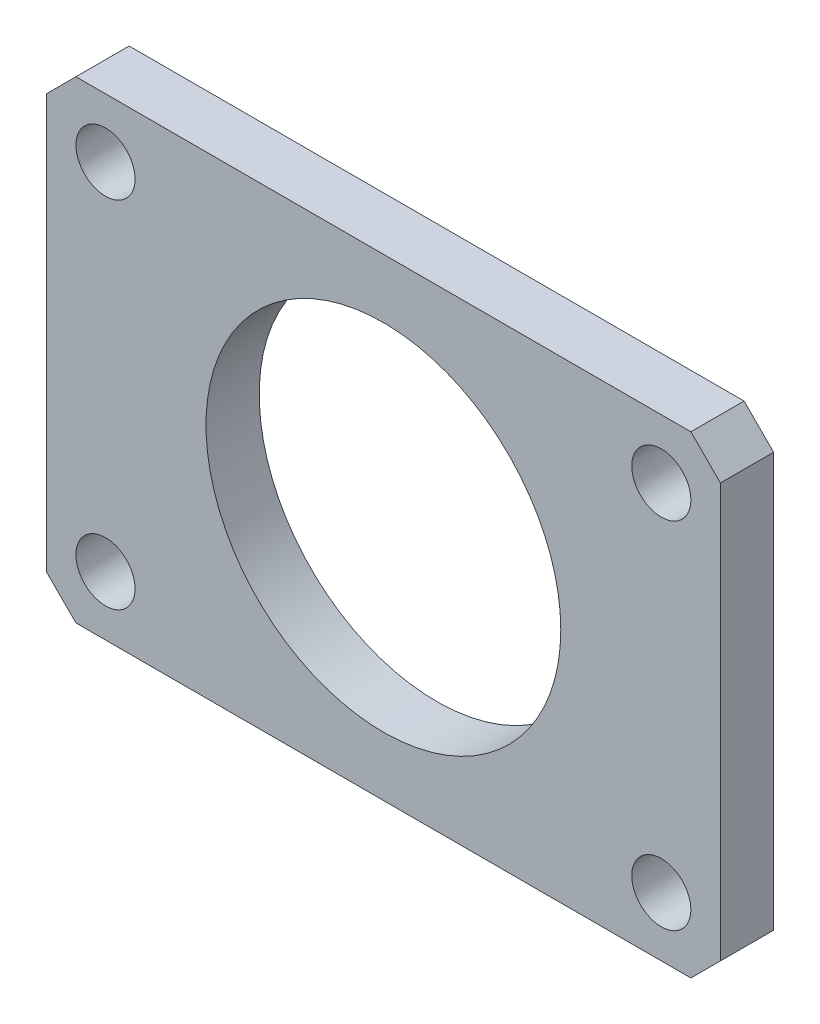
ISO-10303-21;
HEADER;
FILE_DESCRIPTION(('STEP AP214'),'2;1');
FILE_NAME('part.step','',(''),(''),'','','');
FILE_SCHEMA(('AUTOMOTIVE_DESIGN { 1 0 10303 214 1 1 1 1 }'));
ENDSEC;
DATA;
#1=APPLICATION_CONTEXT('core data for automotive mechanical design processes');
#2=APPLICATION_PROTOCOL_DEFINITION('international standard','automotive_design',2000,#1);
#3=PRODUCT_CONTEXT('',#1,'mechanical');
#4=PRODUCT('Part','Part','',(#3));
#5=PRODUCT_RELATED_PRODUCT_CATEGORY('part','',(#4));
#6=PRODUCT_DEFINITION_FORMATION('','',#4);
#7=PRODUCT_DEFINITION_CONTEXT('part definition',#1,'design');
#8=PRODUCT_DEFINITION('design','',#6,#7);
#9=PRODUCT_DEFINITION_SHAPE('','',#8);
#10=(LENGTH_UNIT() NAMED_UNIT(*) SI_UNIT(.MILLI.,.METRE.));
#11=(NAMED_UNIT(*) PLANE_ANGLE_UNIT() SI_UNIT($,.RADIAN.));
#12=(NAMED_UNIT(*) SI_UNIT($,.STERADIAN.) SOLID_ANGLE_UNIT());
#13=UNCERTAINTY_MEASURE_WITH_UNIT(LENGTH_MEASURE(1.E-05),#10,'distance_accuracy_value','');
#14=(GEOMETRIC_REPRESENTATION_CONTEXT(3) GLOBAL_UNCERTAINTY_ASSIGNED_CONTEXT((#13)) GLOBAL_UNIT_ASSIGNED_CONTEXT((#10,
#11,#12)) REPRESENTATION_CONTEXT('',''));
#15=CARTESIAN_POINT('',(0.,0.,0.));
#16=DIRECTION('',(0.,0.,1.));
#17=DIRECTION('',(1.,0.,0.));
#18=AXIS2_PLACEMENT_3D('',#15,#16,#17);
#19=CARTESIAN_POINT('',(0.,0.,4.5));
#20=DIRECTION('',(0.,0.,-1.));
#21=DIRECTION('',(-1.,0.,0.));
#22=AXIS2_PLACEMENT_3D('',#19,#20,#21);
#23=PLANE('',#22);
#24=CARTESIAN_POINT('',(-14.25,-10.,4.5));
#25=DIRECTION('',(0.,0.,1.));
#26=DIRECTION('',(1.,0.,0.));
#27=AXIS2_PLACEMENT_3D('',#24,#25,#26);
#28=CIRCLE('',#27,15.);
#29=CARTESIAN_POINT('',(0.749999999999994,-10.,4.5));
#30=VERTEX_POINT('',#29);
#31=EDGE_CURVE('E331',#30,#30,#28,.T.);
#32=ORIENTED_EDGE('',*,*,#31,.F.);
#33=EDGE_LOOP('',(#32));
#34=FACE_BOUND('',#33,.T.);
#35=DIRECTION('',(0.,1.,0.));
#36=VECTOR('',#35,1.);
#37=CARTESIAN_POINT('',(14.25,-10.,4.5));
#38=LINE('',#37,#36);
#39=CARTESIAN_POINT('',(14.25,-27.5,4.5));
#40=VERTEX_POINT('',#39);
#41=CARTESIAN_POINT('',(14.25,7.49999999999999,4.5));
#42=VERTEX_POINT('',#41);
#43=EDGE_CURVE('E172',#40,#42,#38,.T.);
#44=ORIENTED_EDGE('',*,*,#43,.T.);
#45=DIRECTION('',(0.707106781186547,-0.707106781186549,0.));
#46=VECTOR('',#45,1.);
#47=CARTESIAN_POINT('',(11.75,10.,4.5));
#48=LINE('',#47,#46);
#49=CARTESIAN_POINT('',(11.75,10.,4.5));
#50=VERTEX_POINT('',#49);
#51=EDGE_CURVE('E11',#42,#50,#48,.F.);
#52=ORIENTED_EDGE('',*,*,#51,.T.);
#53=DIRECTION('',(-1.,0.,0.));
#54=VECTOR('',#53,1.);
#55=CARTESIAN_POINT('',(-14.25,10.,4.5));
#56=LINE('',#55,#54);
#57=CARTESIAN_POINT('',(-40.25,10.,4.5));
#58=VERTEX_POINT('',#57);
#59=EDGE_CURVE('E174',#50,#58,#56,.T.);
#60=ORIENTED_EDGE('',*,*,#59,.T.);
#61=DIRECTION('',(-0.707106781186547,-0.707106781186549,0.));
#62=VECTOR('',#61,1.);
#63=CARTESIAN_POINT('',(-40.25,10.,4.5));
#64=LINE('',#63,#62);
#65=CARTESIAN_POINT('',(-42.75,7.49999999999999,4.5));
#66=VERTEX_POINT('',#65);
#67=EDGE_CURVE('E147',#66,#58,#64,.F.);
#68=ORIENTED_EDGE('',*,*,#67,.F.);
#69=DIRECTION('',(0.,1.,0.));
#70=VECTOR('',#69,1.);
#71=CARTESIAN_POINT('',(-42.75,-10.,4.5));
#72=LINE('',#71,#70);
#73=CARTESIAN_POINT('',(-42.75,-27.5,4.5));
#74=VERTEX_POINT('',#73);
#75=EDGE_CURVE('E135',#74,#66,#72,.T.);
#76=ORIENTED_EDGE('',*,*,#75,.F.);
#77=DIRECTION('',(-0.707106781186547,0.707106781186549,0.));
#78=VECTOR('',#77,1.);
#79=CARTESIAN_POINT('',(-40.25,-30.,4.5));
#80=LINE('',#79,#78);
#81=CARTESIAN_POINT('',(-40.25,-30.,4.5));
#82=VERTEX_POINT('',#81);
#83=EDGE_CURVE('E123',#74,#82,#80,.F.);
#84=ORIENTED_EDGE('',*,*,#83,.T.);
#85=DIRECTION('',(-1.,0.,0.));
#86=VECTOR('',#85,1.);
#87=CARTESIAN_POINT('',(-14.25,-30.,4.5));
#88=LINE('',#87,#86);
#89=CARTESIAN_POINT('',(11.75,-30.,4.5));
#90=VERTEX_POINT('',#89);
#91=EDGE_CURVE('E107',#90,#82,#88,.T.);
#92=ORIENTED_EDGE('',*,*,#91,.F.);
#93=DIRECTION('',(0.707106781186547,0.707106781186549,0.));
#94=VECTOR('',#93,1.);
#95=CARTESIAN_POINT('',(11.75,-30.,4.5));
#96=LINE('',#95,#94);
#97=EDGE_CURVE('E162',#40,#90,#96,.F.);
#98=ORIENTED_EDGE('',*,*,#97,.F.);
#99=EDGE_LOOP('',(#44,#52,#60,#68,#76,#84,#92,#98));
#100=FACE_BOUND('',#99,.T.);
#101=CARTESIAN_POINT('',(9.24999999999999,5.,4.5));
#102=DIRECTION('',(0.,0.,1.));
#103=DIRECTION('',(1.,0.,0.));
#104=AXIS2_PLACEMENT_3D('',#101,#102,#103);
#105=CIRCLE('',#104,2.5);
#106=CARTESIAN_POINT('',(11.75,5.,4.5));
#107=VERTEX_POINT('',#106);
#108=EDGE_CURVE('E166',#107,#107,#105,.T.);
#109=ORIENTED_EDGE('',*,*,#108,.F.);
#110=EDGE_LOOP('',(#109));
#111=FACE_BOUND('',#110,.T.);
#112=CARTESIAN_POINT('',(9.24999999999999,-25.,4.5));
#113=DIRECTION('',(0.,0.,-1.));
#114=DIRECTION('',(1.,0.,0.));
#115=AXIS2_PLACEMENT_3D('',#112,#113,#114);
#116=CIRCLE('',#115,2.5);
#117=CARTESIAN_POINT('',(11.75,-25.,4.5));
#118=VERTEX_POINT('',#117);
#119=EDGE_CURVE('E108',#118,#118,#116,.T.);
#120=ORIENTED_EDGE('',*,*,#119,.T.);
#121=EDGE_LOOP('',(#120));
#122=FACE_BOUND('',#121,.T.);
#123=CARTESIAN_POINT('',(-37.75,5.,4.5));
#124=DIRECTION('',(0.,0.,-1.));
#125=DIRECTION('',(-1.,0.,0.));
#126=AXIS2_PLACEMENT_3D('',#123,#124,#125);
#127=CIRCLE('',#126,2.5);
#128=CARTESIAN_POINT('',(-40.25,5.,4.5));
#129=VERTEX_POINT('',#128);
#130=EDGE_CURVE('E129',#129,#129,#127,.T.);
#131=ORIENTED_EDGE('',*,*,#130,.T.);
#132=EDGE_LOOP('',(#131));
#133=FACE_BOUND('',#132,.T.);
#134=CARTESIAN_POINT('',(-37.75,-25.,4.5));
#135=DIRECTION('',(0.,0.,1.));
#136=DIRECTION('',(-1.,0.,0.));
#137=AXIS2_PLACEMENT_3D('',#134,#135,#136);
#138=CIRCLE('',#137,2.5);
#139=CARTESIAN_POINT('',(-40.25,-25.,4.5));
#140=VERTEX_POINT('',#139);
#141=EDGE_CURVE('E117',#140,#140,#138,.T.);
#142=ORIENTED_EDGE('',*,*,#141,.F.);
#143=EDGE_LOOP('',(#142));
#144=FACE_BOUND('',#143,.T.);
#145=ADVANCED_FACE('F34',(#34,#100,#111,#122,#133,#144),#23,.F.);
#146=CARTESIAN_POINT('',(0.,0.,0.));
#147=DIRECTION('',(0.,0.,-1.));
#148=DIRECTION('',(-1.,0.,0.));
#149=AXIS2_PLACEMENT_3D('',#146,#147,#148);
#150=PLANE('',#149);
#151=CARTESIAN_POINT('',(-14.25,-10.,0.));
#152=DIRECTION('',(0.,0.,1.));
#153=DIRECTION('',(1.,0.,0.));
#154=AXIS2_PLACEMENT_3D('',#151,#152,#153);
#155=CIRCLE('',#154,15.);
#156=CARTESIAN_POINT('',(0.749999999999994,-10.,0.));
#157=VERTEX_POINT('',#156);
#158=EDGE_CURVE('E329',#157,#157,#155,.T.);
#159=ORIENTED_EDGE('',*,*,#158,.T.);
#160=EDGE_LOOP('',(#159));
#161=FACE_BOUND('',#160,.T.);
#162=DIRECTION('',(-1.,0.,0.));
#163=VECTOR('',#162,1.);
#164=CARTESIAN_POINT('',(-14.25,10.,0.));
#165=LINE('',#164,#163);
#166=CARTESIAN_POINT('',(11.75,10.,0.));
#167=VERTEX_POINT('',#166);
#168=CARTESIAN_POINT('',(-40.25,10.,0.));
#169=VERTEX_POINT('',#168);
#170=EDGE_CURVE('E175',#167,#169,#165,.T.);
#171=ORIENTED_EDGE('',*,*,#170,.F.);
#172=DIRECTION('',(-0.707106781186547,0.707106781186549,0.));
#173=VECTOR('',#172,1.);
#174=CARTESIAN_POINT('',(10.875,10.875,0.));
#175=LINE('',#174,#173);
#176=CARTESIAN_POINT('',(14.25,7.49999999999999,0.));
#177=VERTEX_POINT('',#176);
#178=EDGE_CURVE('E56',#167,#177,#175,.F.);
#179=ORIENTED_EDGE('',*,*,#178,.T.);
#180=DIRECTION('',(0.,1.,0.));
#181=VECTOR('',#180,1.);
#182=CARTESIAN_POINT('',(14.25,-10.,0.));
#183=LINE('',#182,#181);
#184=CARTESIAN_POINT('',(14.25,-27.5,0.));
#185=VERTEX_POINT('',#184);
#186=EDGE_CURVE('E169',#185,#177,#183,.T.);
#187=ORIENTED_EDGE('',*,*,#186,.F.);
#188=DIRECTION('',(-0.707106781186547,-0.707106781186549,0.));
#189=VECTOR('',#188,1.);
#190=CARTESIAN_POINT('',(10.875,-30.875,0.));
#191=LINE('',#190,#189);
#192=CARTESIAN_POINT('',(11.75,-30.,0.));
#193=VERTEX_POINT('',#192);
#194=EDGE_CURVE('E105',#193,#185,#191,.F.);
#195=ORIENTED_EDGE('',*,*,#194,.F.);
#196=DIRECTION('',(-1.,0.,0.));
#197=VECTOR('',#196,1.);
#198=CARTESIAN_POINT('',(-14.25,-30.,0.));
#199=LINE('',#198,#197);
#200=CARTESIAN_POINT('',(-40.25,-30.,0.));
#201=VERTEX_POINT('',#200);
#202=EDGE_CURVE('E97',#193,#201,#199,.T.);
#203=ORIENTED_EDGE('',*,*,#202,.T.);
#204=DIRECTION('',(0.707106781186547,-0.707106781186549,0.));
#205=VECTOR('',#204,1.);
#206=CARTESIAN_POINT('',(-39.375,-30.875,0.));
#207=LINE('',#206,#205);
#208=CARTESIAN_POINT('',(-42.75,-27.5,0.));
#209=VERTEX_POINT('',#208);
#210=EDGE_CURVE('E103',#201,#209,#207,.F.);
#211=ORIENTED_EDGE('',*,*,#210,.T.);
#212=DIRECTION('',(0.,1.,0.));
#213=VECTOR('',#212,1.);
#214=CARTESIAN_POINT('',(-42.75,-10.,0.));
#215=LINE('',#214,#213);
#216=CARTESIAN_POINT('',(-42.75,7.49999999999999,0.));
#217=VERTEX_POINT('',#216);
#218=EDGE_CURVE('E132',#209,#217,#215,.T.);
#219=ORIENTED_EDGE('',*,*,#218,.T.);
#220=DIRECTION('',(0.707106781186547,0.707106781186549,0.));
#221=VECTOR('',#220,1.);
#222=CARTESIAN_POINT('',(-39.375,10.875,0.));
#223=LINE('',#222,#221);
#224=EDGE_CURVE('E142',#169,#217,#223,.F.);
#225=ORIENTED_EDGE('',*,*,#224,.F.);
#226=EDGE_LOOP('',(#171,#179,#187,#195,#203,#211,#219,#225));
#227=FACE_BOUND('',#226,.T.);
#228=CARTESIAN_POINT('',(9.24999999999999,5.,0.));
#229=DIRECTION('',(0.,0.,1.));
#230=DIRECTION('',(1.,0.,0.));
#231=AXIS2_PLACEMENT_3D('',#228,#229,#230);
#232=CIRCLE('',#231,2.5);
#233=CARTESIAN_POINT('',(11.75,5.,0.));
#234=VERTEX_POINT('',#233);
#235=EDGE_CURVE('E165',#234,#234,#232,.T.);
#236=ORIENTED_EDGE('',*,*,#235,.T.);
#237=EDGE_LOOP('',(#236));
#238=FACE_BOUND('',#237,.T.);
#239=CARTESIAN_POINT('',(9.24999999999999,-25.,0.));
#240=DIRECTION('',(0.,0.,-1.));
#241=DIRECTION('',(1.,0.,0.));
#242=AXIS2_PLACEMENT_3D('',#239,#240,#241);
#243=CIRCLE('',#242,2.5);
#244=CARTESIAN_POINT('',(11.75,-25.,0.));
#245=VERTEX_POINT('',#244);
#246=EDGE_CURVE('E150',#245,#245,#243,.T.);
#247=ORIENTED_EDGE('',*,*,#246,.F.);
#248=EDGE_LOOP('',(#247));
#249=FACE_BOUND('',#248,.T.);
#250=CARTESIAN_POINT('',(-37.75,5.,0.));
#251=DIRECTION('',(0.,0.,-1.));
#252=DIRECTION('',(-1.,0.,0.));
#253=AXIS2_PLACEMENT_3D('',#250,#251,#252);
#254=CIRCLE('',#253,2.5);
#255=CARTESIAN_POINT('',(-40.25,5.,0.));
#256=VERTEX_POINT('',#255);
#257=EDGE_CURVE('E128',#256,#256,#254,.T.);
#258=ORIENTED_EDGE('',*,*,#257,.F.);
#259=EDGE_LOOP('',(#258));
#260=FACE_BOUND('',#259,.T.);
#261=CARTESIAN_POINT('',(-37.75,-25.,0.));
#262=DIRECTION('',(0.,0.,1.));
#263=DIRECTION('',(-1.,0.,0.));
#264=AXIS2_PLACEMENT_3D('',#261,#262,#263);
#265=CIRCLE('',#264,2.5);
#266=CARTESIAN_POINT('',(-40.25,-25.,0.));
#267=VERTEX_POINT('',#266);
#268=EDGE_CURVE('E333',#267,#267,#265,.T.);
#269=ORIENTED_EDGE('',*,*,#268,.T.);
#270=EDGE_LOOP('',(#269));
#271=FACE_BOUND('',#270,.T.);
#272=ADVANCED_FACE('F99',(#161,#227,#238,#249,#260,#271),#150,.T.);
#273=CARTESIAN_POINT('',(14.25,-10.,4.5));
#274=DIRECTION('',(-1.,0.,0.));
#275=DIRECTION('',(0.,0.,1.));
#276=AXIS2_PLACEMENT_3D('',#273,#274,#275);
#277=PLANE('',#276);
#278=ORIENTED_EDGE('',*,*,#186,.T.);
#279=DIRECTION('',(0.,0.,1.));
#280=VECTOR('',#279,1.);
#281=CARTESIAN_POINT('',(14.25,7.49999999999999,4.5));
#282=LINE('',#281,#280);
#283=EDGE_CURVE('E42',#177,#42,#282,.T.);
#284=ORIENTED_EDGE('',*,*,#283,.T.);
#285=ORIENTED_EDGE('',*,*,#43,.F.);
#286=DIRECTION('',(0.,0.,1.));
#287=VECTOR('',#286,1.);
#288=CARTESIAN_POINT('',(14.25,-27.5,4.5));
#289=LINE('',#288,#287);
#290=EDGE_CURVE('E159',#185,#40,#289,.T.);
#291=ORIENTED_EDGE('',*,*,#290,.F.);
#292=EDGE_LOOP('',(#278,#284,#285,#291));
#293=FACE_BOUND('',#292,.T.);
#294=ADVANCED_FACE('F202',(#293),#277,.F.);
#295=CARTESIAN_POINT('',(-14.25,10.,4.5));
#296=DIRECTION('',(0.,-1.,0.));
#297=DIRECTION('',(0.,0.,-1.));
#298=AXIS2_PLACEMENT_3D('',#295,#296,#297);
#299=PLANE('',#298);
#300=ORIENTED_EDGE('',*,*,#59,.F.);
#301=DIRECTION('',(0.,0.,-1.));
#302=VECTOR('',#301,1.);
#303=CARTESIAN_POINT('',(11.75,10.,4.5));
#304=LINE('',#303,#302);
#305=EDGE_CURVE('E177',#50,#167,#304,.T.);
#306=ORIENTED_EDGE('',*,*,#305,.T.);
#307=ORIENTED_EDGE('',*,*,#170,.T.);
#308=DIRECTION('',(0.,0.,-1.));
#309=VECTOR('',#308,1.);
#310=CARTESIAN_POINT('',(-40.25,10.,4.5));
#311=LINE('',#310,#309);
#312=EDGE_CURVE('E138',#58,#169,#311,.T.);
#313=ORIENTED_EDGE('',*,*,#312,.F.);
#314=EDGE_LOOP('',(#300,#306,#307,#313));
#315=FACE_BOUND('',#314,.T.);
#316=ADVANCED_FACE('F185',(#315),#299,.F.);
#317=CARTESIAN_POINT('',(9.24999999999999,5.,4.5));
#318=DIRECTION('',(0.,0.,-1.));
#319=DIRECTION('',(-1.,0.,0.));
#320=AXIS2_PLACEMENT_3D('',#317,#318,#319);
#321=CYLINDRICAL_SURFACE('',#320,2.5);
#322=ORIENTED_EDGE('',*,*,#108,.T.);
#323=EDGE_LOOP('',(#322));
#324=FACE_BOUND('',#323,.T.);
#325=ORIENTED_EDGE('',*,*,#235,.F.);
#326=EDGE_LOOP('',(#325));
#327=FACE_BOUND('',#326,.T.);
#328=ADVANCED_FACE('F204',(#324,#327),#321,.F.);
#329=CARTESIAN_POINT('',(11.75,10.,4.5));
#330=DIRECTION('',(-0.707106781186549,-0.707106781186547,0.));
#331=DIRECTION('',(0.,0.,-1.));
#332=AXIS2_PLACEMENT_3D('',#329,#330,#331);
#333=PLANE('',#332);
#334=ORIENTED_EDGE('',*,*,#51,.F.);
#335=ORIENTED_EDGE('',*,*,#283,.F.);
#336=ORIENTED_EDGE('',*,*,#178,.F.);
#337=ORIENTED_EDGE('',*,*,#305,.F.);
#338=EDGE_LOOP('',(#334,#335,#336,#337));
#339=FACE_BOUND('',#338,.T.);
#340=ADVANCED_FACE('F36',(#339),#333,.F.);
#341=CARTESIAN_POINT('',(-14.25,-30.,4.5));
#342=DIRECTION('',(0.,1.,0.));
#343=DIRECTION('',(0.,0.,-1.));
#344=AXIS2_PLACEMENT_3D('',#341,#342,#343);
#345=PLANE('',#344);
#346=ORIENTED_EDGE('',*,*,#91,.T.);
#347=DIRECTION('',(0.,0.,-1.));
#348=VECTOR('',#347,1.);
#349=CARTESIAN_POINT('',(-40.25,-30.,4.5));
#350=LINE('',#349,#348);
#351=EDGE_CURVE('E111',#82,#201,#350,.T.);
#352=ORIENTED_EDGE('',*,*,#351,.T.);
#353=ORIENTED_EDGE('',*,*,#202,.F.);
#354=DIRECTION('',(0.,0.,-1.));
#355=VECTOR('',#354,1.);
#356=CARTESIAN_POINT('',(11.75,-30.,4.5));
#357=LINE('',#356,#355);
#358=EDGE_CURVE('E155',#90,#193,#357,.T.);
#359=ORIENTED_EDGE('',*,*,#358,.F.);
#360=EDGE_LOOP('',(#346,#352,#353,#359));
#361=FACE_BOUND('',#360,.T.);
#362=ADVANCED_FACE('F112',(#361),#345,.F.);
#363=CARTESIAN_POINT('',(9.24999999999999,-25.,4.5));
#364=DIRECTION('',(0.,0.,-1.));
#365=DIRECTION('',(-1.,0.,0.));
#366=AXIS2_PLACEMENT_3D('',#363,#364,#365);
#367=CYLINDRICAL_SURFACE('',#366,2.5);
#368=ORIENTED_EDGE('',*,*,#119,.F.);
#369=EDGE_LOOP('',(#368));
#370=FACE_BOUND('',#369,.T.);
#371=ORIENTED_EDGE('',*,*,#246,.T.);
#372=EDGE_LOOP('',(#371));
#373=FACE_BOUND('',#372,.T.);
#374=ADVANCED_FACE('F209',(#370,#373),#367,.F.);
#375=CARTESIAN_POINT('',(11.75,-30.,4.5));
#376=DIRECTION('',(-0.707106781186549,0.707106781186547,0.));
#377=DIRECTION('',(0.,0.,-1.));
#378=AXIS2_PLACEMENT_3D('',#375,#376,#377);
#379=PLANE('',#378);
#380=ORIENTED_EDGE('',*,*,#97,.T.);
#381=ORIENTED_EDGE('',*,*,#358,.T.);
#382=ORIENTED_EDGE('',*,*,#194,.T.);
#383=ORIENTED_EDGE('',*,*,#290,.T.);
#384=EDGE_LOOP('',(#380,#381,#382,#383));
#385=FACE_BOUND('',#384,.T.);
#386=ADVANCED_FACE('F200',(#385),#379,.F.);
#387=CARTESIAN_POINT('',(-42.75,-10.,4.5));
#388=DIRECTION('',(1.,0.,0.));
#389=DIRECTION('',(0.,0.,1.));
#390=AXIS2_PLACEMENT_3D('',#387,#388,#389);
#391=PLANE('',#390);
#392=ORIENTED_EDGE('',*,*,#218,.F.);
#393=DIRECTION('',(0.,0.,1.));
#394=VECTOR('',#393,1.);
#395=CARTESIAN_POINT('',(-42.75,-27.5,4.5));
#396=LINE('',#395,#394);
#397=EDGE_CURVE('E120',#209,#74,#396,.T.);
#398=ORIENTED_EDGE('',*,*,#397,.T.);
#399=ORIENTED_EDGE('',*,*,#75,.T.);
#400=DIRECTION('',(0.,0.,1.));
#401=VECTOR('',#400,1.);
#402=CARTESIAN_POINT('',(-42.75,7.49999999999999,4.5));
#403=LINE('',#402,#401);
#404=EDGE_CURVE('E145',#217,#66,#403,.T.);
#405=ORIENTED_EDGE('',*,*,#404,.F.);
#406=EDGE_LOOP('',(#392,#398,#399,#405));
#407=FACE_BOUND('',#406,.T.);
#408=ADVANCED_FACE('F197',(#407),#391,.F.);
#409=CARTESIAN_POINT('',(-37.75,5.,4.5));
#410=DIRECTION('',(0.,0.,-1.));
#411=DIRECTION('',(1.,0.,0.));
#412=AXIS2_PLACEMENT_3D('',#409,#410,#411);
#413=CYLINDRICAL_SURFACE('',#412,2.5);
#414=ORIENTED_EDGE('',*,*,#130,.F.);
#415=EDGE_LOOP('',(#414));
#416=FACE_BOUND('',#415,.T.);
#417=ORIENTED_EDGE('',*,*,#257,.T.);
#418=EDGE_LOOP('',(#417));
#419=FACE_BOUND('',#418,.T.);
#420=ADVANCED_FACE('F277',(#416,#419),#413,.F.);
#421=CARTESIAN_POINT('',(-40.25,10.,4.5));
#422=DIRECTION('',(0.707106781186549,-0.707106781186547,0.));
#423=DIRECTION('',(0.,0.,-1.));
#424=AXIS2_PLACEMENT_3D('',#421,#422,#423);
#425=PLANE('',#424);
#426=ORIENTED_EDGE('',*,*,#67,.T.);
#427=ORIENTED_EDGE('',*,*,#312,.T.);
#428=ORIENTED_EDGE('',*,*,#224,.T.);
#429=ORIENTED_EDGE('',*,*,#404,.T.);
#430=EDGE_LOOP('',(#426,#427,#428,#429));
#431=FACE_BOUND('',#430,.T.);
#432=ADVANCED_FACE('F191',(#431),#425,.F.);
#433=CARTESIAN_POINT('',(-37.75,-25.,4.5));
#434=DIRECTION('',(0.,0.,-1.));
#435=DIRECTION('',(1.,0.,0.));
#436=AXIS2_PLACEMENT_3D('',#433,#434,#435);
#437=CYLINDRICAL_SURFACE('',#436,2.5);
#438=ORIENTED_EDGE('',*,*,#141,.T.);
#439=EDGE_LOOP('',(#438));
#440=FACE_BOUND('',#439,.T.);
#441=ORIENTED_EDGE('',*,*,#268,.F.);
#442=EDGE_LOOP('',(#441));
#443=FACE_BOUND('',#442,.T.);
#444=ADVANCED_FACE('F295',(#440,#443),#437,.F.);
#445=CARTESIAN_POINT('',(-40.25,-30.,4.5));
#446=DIRECTION('',(0.707106781186549,0.707106781186547,0.));
#447=DIRECTION('',(0.,0.,-1.));
#448=AXIS2_PLACEMENT_3D('',#445,#446,#447);
#449=PLANE('',#448);
#450=ORIENTED_EDGE('',*,*,#83,.F.);
#451=ORIENTED_EDGE('',*,*,#397,.F.);
#452=ORIENTED_EDGE('',*,*,#210,.F.);
#453=ORIENTED_EDGE('',*,*,#351,.F.);
#454=EDGE_LOOP('',(#450,#451,#452,#453));
#455=FACE_BOUND('',#454,.T.);
#456=ADVANCED_FACE('F119',(#455),#449,.F.);
#457=CARTESIAN_POINT('',(-14.25,-10.,0.));
#458=DIRECTION('',(0.,0.,1.));
#459=DIRECTION('',(1.,0.,0.));
#460=AXIS2_PLACEMENT_3D('',#457,#458,#459);
#461=CYLINDRICAL_SURFACE('',#460,15.);
#462=ORIENTED_EDGE('',*,*,#158,.F.);
#463=EDGE_LOOP('',(#462));
#464=FACE_BOUND('',#463,.T.);
#465=ORIENTED_EDGE('',*,*,#31,.T.);
#466=EDGE_LOOP('',(#465));
#467=FACE_BOUND('',#466,.T.);
#468=ADVANCED_FACE('F313',(#464,#467),#461,.F.);
#469=CLOSED_SHELL('',(#145,#272,#294,#316,#328,#340,#362,#374,#386,#408,#420,#432,#444,#456,#468));
#470=MANIFOLD_SOLID_BREP('B2',#469);
#471=ADVANCED_BREP_SHAPE_REPRESENTATION('',(#18,#470),#14);
#472=SHAPE_DEFINITION_REPRESENTATION(#9,#471);
ENDSEC;
END-ISO-10303-21;
